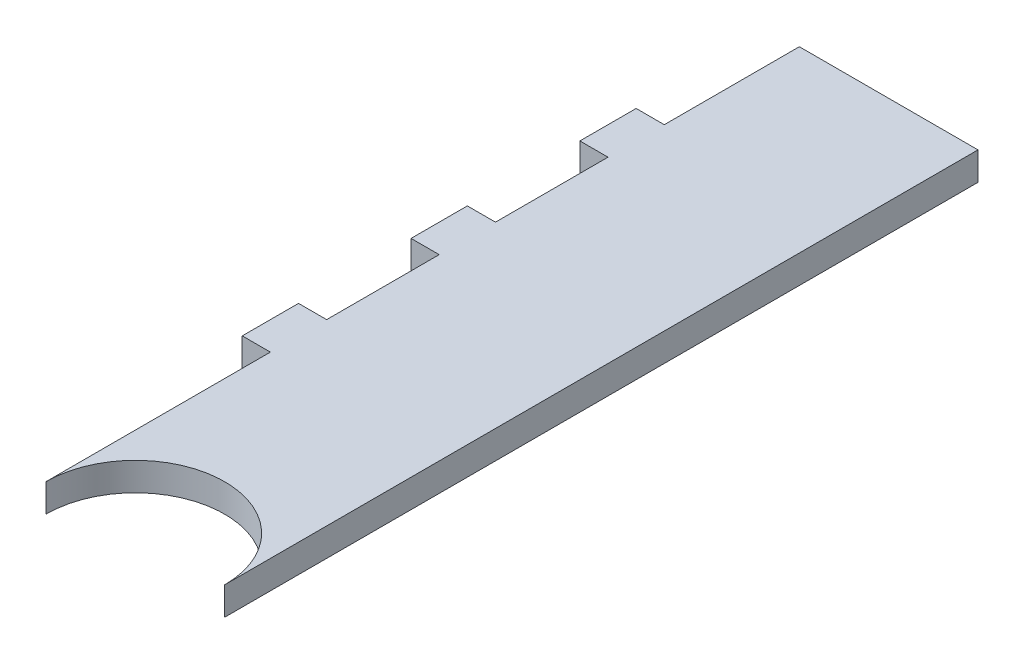
ISO-10303-21;
HEADER;
FILE_DESCRIPTION(('STEP AP214'),'2;1');
FILE_NAME('part.step','',(''),(''),'','','');
FILE_SCHEMA(('AUTOMOTIVE_DESIGN { 1 0 10303 214 1 1 1 1 }'));
ENDSEC;
DATA;
#1=APPLICATION_CONTEXT('core data for automotive mechanical design processes');
#2=APPLICATION_PROTOCOL_DEFINITION('international standard','automotive_design',2000,#1);
#3=PRODUCT_CONTEXT('',#1,'mechanical');
#4=PRODUCT('Part','Part','',(#3));
#5=PRODUCT_RELATED_PRODUCT_CATEGORY('part','',(#4));
#6=PRODUCT_DEFINITION_FORMATION('','',#4);
#7=PRODUCT_DEFINITION_CONTEXT('part definition',#1,'design');
#8=PRODUCT_DEFINITION('design','',#6,#7);
#9=PRODUCT_DEFINITION_SHAPE('','',#8);
#10=(LENGTH_UNIT() NAMED_UNIT(*) SI_UNIT(.MILLI.,.METRE.));
#11=(NAMED_UNIT(*) PLANE_ANGLE_UNIT() SI_UNIT($,.RADIAN.));
#12=(NAMED_UNIT(*) SI_UNIT($,.STERADIAN.) SOLID_ANGLE_UNIT());
#13=UNCERTAINTY_MEASURE_WITH_UNIT(LENGTH_MEASURE(1.E-05),#10,'distance_accuracy_value','');
#14=(GEOMETRIC_REPRESENTATION_CONTEXT(3) GLOBAL_UNCERTAINTY_ASSIGNED_CONTEXT((#13)) GLOBAL_UNIT_ASSIGNED_CONTEXT((#10,
#11,#12)) REPRESENTATION_CONTEXT('',''));
#15=CARTESIAN_POINT('',(0.,0.,0.));
#16=DIRECTION('',(0.,0.,1.));
#17=DIRECTION('',(1.,0.,0.));
#18=AXIS2_PLACEMENT_3D('',#15,#16,#17);
#19=CARTESIAN_POINT('',(-20.875,5.,-109.875));
#20=DIRECTION('',(0.,0.,1.));
#21=DIRECTION('',(1.,0.,0.));
#22=AXIS2_PLACEMENT_3D('',#19,#20,#21);
#23=PLANE('',#22);
#24=DIRECTION('',(-1.,0.,0.));
#25=VECTOR('',#24,1.);
#26=CARTESIAN_POINT('',(-20.875,0.,-109.875));
#27=LINE('',#26,#25);
#28=CARTESIAN_POINT('',(-15.875,0.,-109.875));
#29=VERTEX_POINT('',#28);
#30=CARTESIAN_POINT('',(-20.875,0.,-109.875));
#31=VERTEX_POINT('',#30);
#32=EDGE_CURVE('E183',#29,#31,#27,.T.);
#33=ORIENTED_EDGE('',*,*,#32,.T.);
#34=DIRECTION('',(0.,-1.,0.));
#35=VECTOR('',#34,1.);
#36=CARTESIAN_POINT('',(-20.875,5.,-109.875));
#37=LINE('',#36,#35);
#38=CARTESIAN_POINT('',(-20.875,5.,-109.875));
#39=VERTEX_POINT('',#38);
#40=EDGE_CURVE('E11',#39,#31,#37,.T.);
#41=ORIENTED_EDGE('',*,*,#40,.F.);
#42=DIRECTION('',(-1.,0.,0.));
#43=VECTOR('',#42,1.);
#44=CARTESIAN_POINT('',(-20.875,5.,-109.875));
#45=LINE('',#44,#43);
#46=CARTESIAN_POINT('',(-15.875,5.,-109.875));
#47=VERTEX_POINT('',#46);
#48=EDGE_CURVE('E213',#47,#39,#45,.T.);
#49=ORIENTED_EDGE('',*,*,#48,.F.);
#50=DIRECTION('',(0.,-1.,0.));
#51=VECTOR('',#50,1.);
#52=CARTESIAN_POINT('',(-15.875,5.,-109.875));
#53=LINE('',#52,#51);
#54=EDGE_CURVE('E179',#47,#29,#53,.T.);
#55=ORIENTED_EDGE('',*,*,#54,.T.);
#56=EDGE_LOOP('',(#33,#41,#49,#55));
#57=FACE_BOUND('',#56,.T.);
#58=ADVANCED_FACE('F39',(#57),#23,.F.);
#59=CARTESIAN_POINT('',(-20.875,5.,-99.875));
#60=DIRECTION('',(1.,0.,0.));
#61=DIRECTION('',(0.,0.,-1.));
#62=AXIS2_PLACEMENT_3D('',#59,#60,#61);
#63=PLANE('',#62);
#64=DIRECTION('',(0.,0.,1.));
#65=VECTOR('',#64,1.);
#66=CARTESIAN_POINT('',(-20.875,0.,-99.875));
#67=LINE('',#66,#65);
#68=CARTESIAN_POINT('',(-20.875,0.,-99.875));
#69=VERTEX_POINT('',#68);
#70=EDGE_CURVE('E186',#31,#69,#67,.T.);
#71=ORIENTED_EDGE('',*,*,#70,.T.);
#72=DIRECTION('',(0.,-1.,0.));
#73=VECTOR('',#72,1.);
#74=CARTESIAN_POINT('',(-20.875,5.,-99.875));
#75=LINE('',#74,#73);
#76=CARTESIAN_POINT('',(-20.875,5.,-99.875));
#77=VERTEX_POINT('',#76);
#78=EDGE_CURVE('E47',#77,#69,#75,.T.);
#79=ORIENTED_EDGE('',*,*,#78,.F.);
#80=DIRECTION('',(0.,0.,1.));
#81=VECTOR('',#80,1.);
#82=CARTESIAN_POINT('',(-20.875,5.,-99.875));
#83=LINE('',#82,#81);
#84=EDGE_CURVE('E122',#39,#77,#83,.T.);
#85=ORIENTED_EDGE('',*,*,#84,.F.);
#86=ORIENTED_EDGE('',*,*,#40,.T.);
#87=EDGE_LOOP('',(#71,#79,#85,#86));
#88=FACE_BOUND('',#87,.T.);
#89=ADVANCED_FACE('F311',(#88),#63,.F.);
#90=CARTESIAN_POINT('',(-15.875,5.,-99.875));
#91=DIRECTION('',(0.,0.,-1.));
#92=DIRECTION('',(-1.,0.,0.));
#93=AXIS2_PLACEMENT_3D('',#90,#91,#92);
#94=PLANE('',#93);
#95=DIRECTION('',(1.,0.,0.));
#96=VECTOR('',#95,1.);
#97=CARTESIAN_POINT('',(-15.875,0.,-99.875));
#98=LINE('',#97,#96);
#99=CARTESIAN_POINT('',(-15.875,0.,-99.875));
#100=VERTEX_POINT('',#99);
#101=EDGE_CURVE('E188',#69,#100,#98,.T.);
#102=ORIENTED_EDGE('',*,*,#101,.T.);
#103=DIRECTION('',(0.,-1.,0.));
#104=VECTOR('',#103,1.);
#105=CARTESIAN_POINT('',(-15.875,5.,-99.875));
#106=LINE('',#105,#104);
#107=CARTESIAN_POINT('',(-15.875,5.,-99.875));
#108=VERTEX_POINT('',#107);
#109=EDGE_CURVE('E244',#108,#100,#106,.T.);
#110=ORIENTED_EDGE('',*,*,#109,.F.);
#111=DIRECTION('',(1.,0.,0.));
#112=VECTOR('',#111,1.);
#113=CARTESIAN_POINT('',(-15.875,5.,-99.875));
#114=LINE('',#113,#112);
#115=EDGE_CURVE('E252',#77,#108,#114,.T.);
#116=ORIENTED_EDGE('',*,*,#115,.F.);
#117=ORIENTED_EDGE('',*,*,#78,.T.);
#118=EDGE_LOOP('',(#102,#110,#116,#117));
#119=FACE_BOUND('',#118,.T.);
#120=ADVANCED_FACE('F250',(#119),#94,.F.);
#121=CARTESIAN_POINT('',(-15.875,5.,-79.875));
#122=DIRECTION('',(1.,0.,0.));
#123=DIRECTION('',(0.,0.,-1.));
#124=AXIS2_PLACEMENT_3D('',#121,#122,#123);
#125=PLANE('',#124);
#126=DIRECTION('',(0.,0.,1.));
#127=VECTOR('',#126,1.);
#128=CARTESIAN_POINT('',(-15.875,0.,-79.875));
#129=LINE('',#128,#127);
#130=CARTESIAN_POINT('',(-15.875,0.,-79.875));
#131=VERTEX_POINT('',#130);
#132=EDGE_CURVE('E190',#100,#131,#129,.T.);
#133=ORIENTED_EDGE('',*,*,#132,.T.);
#134=DIRECTION('',(0.,-1.,0.));
#135=VECTOR('',#134,1.);
#136=CARTESIAN_POINT('',(-15.875,5.,-79.875));
#137=LINE('',#136,#135);
#138=CARTESIAN_POINT('',(-15.875,5.,-79.875));
#139=VERTEX_POINT('',#138);
#140=EDGE_CURVE('E241',#139,#131,#137,.T.);
#141=ORIENTED_EDGE('',*,*,#140,.F.);
#142=DIRECTION('',(0.,0.,1.));
#143=VECTOR('',#142,1.);
#144=CARTESIAN_POINT('',(-15.875,5.,-79.875));
#145=LINE('',#144,#143);
#146=EDGE_CURVE('E270',#108,#139,#145,.T.);
#147=ORIENTED_EDGE('',*,*,#146,.F.);
#148=ORIENTED_EDGE('',*,*,#109,.T.);
#149=EDGE_LOOP('',(#133,#141,#147,#148));
#150=FACE_BOUND('',#149,.T.);
#151=ADVANCED_FACE('F261',(#150),#125,.F.);
#152=CARTESIAN_POINT('',(-20.875,5.,-79.875));
#153=DIRECTION('',(0.,0.,1.));
#154=DIRECTION('',(1.,0.,0.));
#155=AXIS2_PLACEMENT_3D('',#152,#153,#154);
#156=PLANE('',#155);
#157=DIRECTION('',(-1.,0.,0.));
#158=VECTOR('',#157,1.);
#159=CARTESIAN_POINT('',(-20.875,0.,-79.875));
#160=LINE('',#159,#158);
#161=CARTESIAN_POINT('',(-20.875,0.,-79.875));
#162=VERTEX_POINT('',#161);
#163=EDGE_CURVE('E192',#131,#162,#160,.T.);
#164=ORIENTED_EDGE('',*,*,#163,.T.);
#165=DIRECTION('',(0.,-1.,0.));
#166=VECTOR('',#165,1.);
#167=CARTESIAN_POINT('',(-20.875,5.,-79.875));
#168=LINE('',#167,#166);
#169=CARTESIAN_POINT('',(-20.875,5.,-79.875));
#170=VERTEX_POINT('',#169);
#171=EDGE_CURVE('E238',#170,#162,#168,.T.);
#172=ORIENTED_EDGE('',*,*,#171,.F.);
#173=DIRECTION('',(-1.,0.,0.));
#174=VECTOR('',#173,1.);
#175=CARTESIAN_POINT('',(-20.875,5.,-79.875));
#176=LINE('',#175,#174);
#177=EDGE_CURVE('E267',#139,#170,#176,.T.);
#178=ORIENTED_EDGE('',*,*,#177,.F.);
#179=ORIENTED_EDGE('',*,*,#140,.T.);
#180=EDGE_LOOP('',(#164,#172,#178,#179));
#181=FACE_BOUND('',#180,.T.);
#182=ADVANCED_FACE('F265',(#181),#156,.F.);
#183=CARTESIAN_POINT('',(-20.875,5.,-69.875));
#184=DIRECTION('',(1.,0.,0.));
#185=DIRECTION('',(0.,0.,-1.));
#186=AXIS2_PLACEMENT_3D('',#183,#184,#185);
#187=PLANE('',#186);
#188=DIRECTION('',(0.,0.,1.));
#189=VECTOR('',#188,1.);
#190=CARTESIAN_POINT('',(-20.875,0.,-69.875));
#191=LINE('',#190,#189);
#192=CARTESIAN_POINT('',(-20.875,0.,-69.875));
#193=VERTEX_POINT('',#192);
#194=EDGE_CURVE('E194',#162,#193,#191,.T.);
#195=ORIENTED_EDGE('',*,*,#194,.T.);
#196=DIRECTION('',(0.,-1.,0.));
#197=VECTOR('',#196,1.);
#198=CARTESIAN_POINT('',(-20.875,5.,-69.875));
#199=LINE('',#198,#197);
#200=CARTESIAN_POINT('',(-20.875,5.,-69.875));
#201=VERTEX_POINT('',#200);
#202=EDGE_CURVE('E235',#201,#193,#199,.T.);
#203=ORIENTED_EDGE('',*,*,#202,.F.);
#204=DIRECTION('',(0.,0.,1.));
#205=VECTOR('',#204,1.);
#206=CARTESIAN_POINT('',(-20.875,5.,-69.875));
#207=LINE('',#206,#205);
#208=EDGE_CURVE('E269',#170,#201,#207,.T.);
#209=ORIENTED_EDGE('',*,*,#208,.F.);
#210=ORIENTED_EDGE('',*,*,#171,.T.);
#211=EDGE_LOOP('',(#195,#203,#209,#210));
#212=FACE_BOUND('',#211,.T.);
#213=ADVANCED_FACE('F324',(#212),#187,.F.);
#214=CARTESIAN_POINT('',(-15.875,5.,-69.875));
#215=DIRECTION('',(0.,0.,-1.));
#216=DIRECTION('',(-1.,0.,0.));
#217=AXIS2_PLACEMENT_3D('',#214,#215,#216);
#218=PLANE('',#217);
#219=DIRECTION('',(1.,0.,0.));
#220=VECTOR('',#219,1.);
#221=CARTESIAN_POINT('',(-15.875,0.,-69.875));
#222=LINE('',#221,#220);
#223=CARTESIAN_POINT('',(-15.875,0.,-69.875));
#224=VERTEX_POINT('',#223);
#225=EDGE_CURVE('E196',#193,#224,#222,.T.);
#226=ORIENTED_EDGE('',*,*,#225,.T.);
#227=DIRECTION('',(0.,-1.,0.));
#228=VECTOR('',#227,1.);
#229=CARTESIAN_POINT('',(-15.875,5.,-69.875));
#230=LINE('',#229,#228);
#231=CARTESIAN_POINT('',(-15.875,5.,-69.875));
#232=VERTEX_POINT('',#231);
#233=EDGE_CURVE('E232',#232,#224,#230,.T.);
#234=ORIENTED_EDGE('',*,*,#233,.F.);
#235=DIRECTION('',(1.,0.,0.));
#236=VECTOR('',#235,1.);
#237=CARTESIAN_POINT('',(-15.875,5.,-69.875));
#238=LINE('',#237,#236);
#239=EDGE_CURVE('E272',#201,#232,#238,.T.);
#240=ORIENTED_EDGE('',*,*,#239,.F.);
#241=ORIENTED_EDGE('',*,*,#202,.T.);
#242=EDGE_LOOP('',(#226,#234,#240,#241));
#243=FACE_BOUND('',#242,.T.);
#244=ADVANCED_FACE('F327',(#243),#218,.F.);
#245=CARTESIAN_POINT('',(-15.875,5.,-49.875));
#246=DIRECTION('',(1.,0.,0.));
#247=DIRECTION('',(0.,0.,-1.));
#248=AXIS2_PLACEMENT_3D('',#245,#246,#247);
#249=PLANE('',#248);
#250=DIRECTION('',(0.,0.,1.));
#251=VECTOR('',#250,1.);
#252=CARTESIAN_POINT('',(-15.875,0.,-49.875));
#253=LINE('',#252,#251);
#254=CARTESIAN_POINT('',(-15.875,0.,-49.875));
#255=VERTEX_POINT('',#254);
#256=EDGE_CURVE('E198',#224,#255,#253,.T.);
#257=ORIENTED_EDGE('',*,*,#256,.T.);
#258=DIRECTION('',(0.,-1.,0.));
#259=VECTOR('',#258,1.);
#260=CARTESIAN_POINT('',(-15.875,5.,-49.875));
#261=LINE('',#260,#259);
#262=CARTESIAN_POINT('',(-15.875,5.,-49.875));
#263=VERTEX_POINT('',#262);
#264=EDGE_CURVE('E229',#263,#255,#261,.T.);
#265=ORIENTED_EDGE('',*,*,#264,.F.);
#266=DIRECTION('',(0.,0.,1.));
#267=VECTOR('',#266,1.);
#268=CARTESIAN_POINT('',(-15.875,5.,-49.875));
#269=LINE('',#268,#267);
#270=EDGE_CURVE('E278',#232,#263,#269,.T.);
#271=ORIENTED_EDGE('',*,*,#270,.F.);
#272=ORIENTED_EDGE('',*,*,#233,.T.);
#273=EDGE_LOOP('',(#257,#265,#271,#272));
#274=FACE_BOUND('',#273,.T.);
#275=ADVANCED_FACE('F331',(#274),#249,.F.);
#276=CARTESIAN_POINT('',(-20.875,5.,-49.875));
#277=DIRECTION('',(0.,0.,1.));
#278=DIRECTION('',(1.,0.,0.));
#279=AXIS2_PLACEMENT_3D('',#276,#277,#278);
#280=PLANE('',#279);
#281=DIRECTION('',(-1.,0.,0.));
#282=VECTOR('',#281,1.);
#283=CARTESIAN_POINT('',(-20.875,0.,-49.875));
#284=LINE('',#283,#282);
#285=CARTESIAN_POINT('',(-20.875,0.,-49.875));
#286=VERTEX_POINT('',#285);
#287=EDGE_CURVE('E200',#255,#286,#284,.T.);
#288=ORIENTED_EDGE('',*,*,#287,.T.);
#289=DIRECTION('',(0.,-1.,0.));
#290=VECTOR('',#289,1.);
#291=CARTESIAN_POINT('',(-20.875,5.,-49.875));
#292=LINE('',#291,#290);
#293=CARTESIAN_POINT('',(-20.875,5.,-49.875));
#294=VERTEX_POINT('',#293);
#295=EDGE_CURVE('E226',#294,#286,#292,.T.);
#296=ORIENTED_EDGE('',*,*,#295,.F.);
#297=DIRECTION('',(-1.,0.,0.));
#298=VECTOR('',#297,1.);
#299=CARTESIAN_POINT('',(-20.875,5.,-49.875));
#300=LINE('',#299,#298);
#301=EDGE_CURVE('E280',#263,#294,#300,.T.);
#302=ORIENTED_EDGE('',*,*,#301,.F.);
#303=ORIENTED_EDGE('',*,*,#264,.T.);
#304=EDGE_LOOP('',(#288,#296,#302,#303));
#305=FACE_BOUND('',#304,.T.);
#306=ADVANCED_FACE('F335',(#305),#280,.F.);
#307=CARTESIAN_POINT('',(-20.875,5.,-39.875));
#308=DIRECTION('',(1.,0.,0.));
#309=DIRECTION('',(0.,0.,-1.));
#310=AXIS2_PLACEMENT_3D('',#307,#308,#309);
#311=PLANE('',#310);
#312=DIRECTION('',(0.,0.,1.));
#313=VECTOR('',#312,1.);
#314=CARTESIAN_POINT('',(-20.875,0.,-39.875));
#315=LINE('',#314,#313);
#316=CARTESIAN_POINT('',(-20.875,0.,-39.875));
#317=VERTEX_POINT('',#316);
#318=EDGE_CURVE('E202',#286,#317,#315,.T.);
#319=ORIENTED_EDGE('',*,*,#318,.T.);
#320=DIRECTION('',(0.,-1.,0.));
#321=VECTOR('',#320,1.);
#322=CARTESIAN_POINT('',(-20.875,5.,-39.875));
#323=LINE('',#322,#321);
#324=CARTESIAN_POINT('',(-20.875,5.,-39.875));
#325=VERTEX_POINT('',#324);
#326=EDGE_CURVE('E223',#325,#317,#323,.T.);
#327=ORIENTED_EDGE('',*,*,#326,.F.);
#328=DIRECTION('',(0.,0.,1.));
#329=VECTOR('',#328,1.);
#330=CARTESIAN_POINT('',(-20.875,5.,-39.875));
#331=LINE('',#330,#329);
#332=EDGE_CURVE('E282',#294,#325,#331,.T.);
#333=ORIENTED_EDGE('',*,*,#332,.F.);
#334=ORIENTED_EDGE('',*,*,#295,.T.);
#335=EDGE_LOOP('',(#319,#327,#333,#334));
#336=FACE_BOUND('',#335,.T.);
#337=ADVANCED_FACE('F339',(#336),#311,.F.);
#338=CARTESIAN_POINT('',(-15.875,5.,-39.875));
#339=DIRECTION('',(0.,0.,-1.));
#340=DIRECTION('',(-1.,0.,0.));
#341=AXIS2_PLACEMENT_3D('',#338,#339,#340);
#342=PLANE('',#341);
#343=DIRECTION('',(1.,0.,0.));
#344=VECTOR('',#343,1.);
#345=CARTESIAN_POINT('',(-15.875,0.,-39.875));
#346=LINE('',#345,#344);
#347=CARTESIAN_POINT('',(-15.875,0.,-39.875));
#348=VERTEX_POINT('',#347);
#349=EDGE_CURVE('E204',#317,#348,#346,.T.);
#350=ORIENTED_EDGE('',*,*,#349,.T.);
#351=DIRECTION('',(0.,-1.,0.));
#352=VECTOR('',#351,1.);
#353=CARTESIAN_POINT('',(-15.875,5.,-39.875));
#354=LINE('',#353,#352);
#355=CARTESIAN_POINT('',(-15.875,5.,-39.875));
#356=VERTEX_POINT('',#355);
#357=EDGE_CURVE('E220',#356,#348,#354,.T.);
#358=ORIENTED_EDGE('',*,*,#357,.F.);
#359=DIRECTION('',(1.,0.,0.));
#360=VECTOR('',#359,1.);
#361=CARTESIAN_POINT('',(-15.875,5.,-39.875));
#362=LINE('',#361,#360);
#363=EDGE_CURVE('E284',#325,#356,#362,.T.);
#364=ORIENTED_EDGE('',*,*,#363,.F.);
#365=ORIENTED_EDGE('',*,*,#326,.T.);
#366=EDGE_LOOP('',(#350,#358,#364,#365));
#367=FACE_BOUND('',#366,.T.);
#368=ADVANCED_FACE('F343',(#367),#342,.F.);
#369=CARTESIAN_POINT('',(-15.875,5.,0.));
#370=DIRECTION('',(1.,0.,0.));
#371=DIRECTION('',(0.,0.,-1.));
#372=AXIS2_PLACEMENT_3D('',#369,#370,#371);
#373=PLANE('',#372);
#374=DIRECTION('',(0.,0.,1.));
#375=VECTOR('',#374,1.);
#376=CARTESIAN_POINT('',(-15.875,0.,0.));
#377=LINE('',#376,#375);
#378=CARTESIAN_POINT('',(-15.875,0.,0.));
#379=VERTEX_POINT('',#378);
#380=EDGE_CURVE('E206',#348,#379,#377,.T.);
#381=ORIENTED_EDGE('',*,*,#380,.T.);
#382=DIRECTION('',(0.,-1.,0.));
#383=VECTOR('',#382,1.);
#384=CARTESIAN_POINT('',(-15.875,5.,0.));
#385=LINE('',#384,#383);
#386=CARTESIAN_POINT('',(-15.875,5.,0.));
#387=VERTEX_POINT('',#386);
#388=EDGE_CURVE('E217',#387,#379,#385,.T.);
#389=ORIENTED_EDGE('',*,*,#388,.F.);
#390=DIRECTION('',(0.,0.,1.));
#391=VECTOR('',#390,1.);
#392=CARTESIAN_POINT('',(-15.875,5.,0.));
#393=LINE('',#392,#391);
#394=EDGE_CURVE('E286',#356,#387,#393,.T.);
#395=ORIENTED_EDGE('',*,*,#394,.F.);
#396=ORIENTED_EDGE('',*,*,#357,.T.);
#397=EDGE_LOOP('',(#381,#389,#395,#396));
#398=FACE_BOUND('',#397,.T.);
#399=ADVANCED_FACE('F292',(#398),#373,.F.);
#400=CARTESIAN_POINT('',(0.,5.,0.));
#401=DIRECTION('',(0.,-1.,0.));
#402=DIRECTION('',(0.,0.,-1.));
#403=AXIS2_PLACEMENT_3D('',#400,#401,#402);
#404=CYLINDRICAL_SURFACE('',#403,15.875);
#405=CARTESIAN_POINT('',(0.,0.,0.));
#406=DIRECTION('',(0.,-1.,0.));
#407=DIRECTION('',(0.,0.,1.));
#408=AXIS2_PLACEMENT_3D('',#405,#406,#407);
#409=CIRCLE('',#408,15.875);
#410=CARTESIAN_POINT('',(15.875,0.,0.));
#411=VERTEX_POINT('',#410);
#412=EDGE_CURVE('E208',#379,#411,#409,.T.);
#413=ORIENTED_EDGE('',*,*,#412,.T.);
#414=DIRECTION('',(0.,-1.,0.));
#415=VECTOR('',#414,1.);
#416=CARTESIAN_POINT('',(15.875,5.,0.));
#417=LINE('',#416,#415);
#418=CARTESIAN_POINT('',(15.875,5.,0.));
#419=VERTEX_POINT('',#418);
#420=EDGE_CURVE('E174',#419,#411,#417,.T.);
#421=ORIENTED_EDGE('',*,*,#420,.F.);
#422=CARTESIAN_POINT('',(0.,5.,0.));
#423=DIRECTION('',(0.,-1.,0.));
#424=DIRECTION('',(0.,0.,1.));
#425=AXIS2_PLACEMENT_3D('',#422,#423,#424);
#426=CIRCLE('',#425,15.875);
#427=EDGE_CURVE('E165',#387,#419,#426,.T.);
#428=ORIENTED_EDGE('',*,*,#427,.F.);
#429=ORIENTED_EDGE('',*,*,#388,.T.);
#430=EDGE_LOOP('',(#413,#421,#428,#429));
#431=FACE_BOUND('',#430,.T.);
#432=ADVANCED_FACE('F296',(#431),#404,.F.);
#433=CARTESIAN_POINT('',(15.875,5.,-133.875));
#434=DIRECTION('',(-1.,0.,0.));
#435=DIRECTION('',(0.,0.,1.));
#436=AXIS2_PLACEMENT_3D('',#433,#434,#435);
#437=PLANE('',#436);
#438=DIRECTION('',(0.,0.,-1.));
#439=VECTOR('',#438,1.);
#440=CARTESIAN_POINT('',(15.875,0.,-133.875));
#441=LINE('',#440,#439);
#442=CARTESIAN_POINT('',(15.875,0.,-133.875));
#443=VERTEX_POINT('',#442);
#444=EDGE_CURVE('E173',#411,#443,#441,.T.);
#445=ORIENTED_EDGE('',*,*,#444,.T.);
#446=DIRECTION('',(0.,-1.,0.));
#447=VECTOR('',#446,1.);
#448=CARTESIAN_POINT('',(15.875,5.,-133.875));
#449=LINE('',#448,#447);
#450=CARTESIAN_POINT('',(15.875,5.,-133.875));
#451=VERTEX_POINT('',#450);
#452=EDGE_CURVE('E170',#451,#443,#449,.T.);
#453=ORIENTED_EDGE('',*,*,#452,.F.);
#454=DIRECTION('',(0.,0.,-1.));
#455=VECTOR('',#454,1.);
#456=CARTESIAN_POINT('',(15.875,5.,-133.875));
#457=LINE('',#456,#455);
#458=EDGE_CURVE('E159',#419,#451,#457,.T.);
#459=ORIENTED_EDGE('',*,*,#458,.F.);
#460=ORIENTED_EDGE('',*,*,#420,.T.);
#461=EDGE_LOOP('',(#445,#453,#459,#460));
#462=FACE_BOUND('',#461,.T.);
#463=ADVANCED_FACE('F171',(#462),#437,.F.);
#464=CARTESIAN_POINT('',(-15.875,5.,-133.875));
#465=DIRECTION('',(0.,0.,1.));
#466=DIRECTION('',(1.,0.,0.));
#467=AXIS2_PLACEMENT_3D('',#464,#465,#466);
#468=PLANE('',#467);
#469=DIRECTION('',(-1.,0.,0.));
#470=VECTOR('',#469,1.);
#471=CARTESIAN_POINT('',(-15.875,0.,-133.875));
#472=LINE('',#471,#470);
#473=CARTESIAN_POINT('',(-15.875,0.,-133.875));
#474=VERTEX_POINT('',#473);
#475=EDGE_CURVE('E108',#443,#474,#472,.T.);
#476=ORIENTED_EDGE('',*,*,#475,.T.);
#477=DIRECTION('',(0.,-1.,0.));
#478=VECTOR('',#477,1.);
#479=CARTESIAN_POINT('',(-15.875,5.,-133.875));
#480=LINE('',#479,#478);
#481=CARTESIAN_POINT('',(-15.875,5.,-133.875));
#482=VERTEX_POINT('',#481);
#483=EDGE_CURVE('E175',#482,#474,#480,.T.);
#484=ORIENTED_EDGE('',*,*,#483,.F.);
#485=DIRECTION('',(-1.,0.,0.));
#486=VECTOR('',#485,1.);
#487=CARTESIAN_POINT('',(-15.875,5.,-133.875));
#488=LINE('',#487,#486);
#489=EDGE_CURVE('E163',#451,#482,#488,.T.);
#490=ORIENTED_EDGE('',*,*,#489,.F.);
#491=ORIENTED_EDGE('',*,*,#452,.T.);
#492=EDGE_LOOP('',(#476,#484,#490,#491));
#493=FACE_BOUND('',#492,.T.);
#494=ADVANCED_FACE('F177',(#493),#468,.F.);
#495=CARTESIAN_POINT('',(-15.875,5.,-109.875));
#496=DIRECTION('',(1.,0.,0.));
#497=DIRECTION('',(0.,0.,-1.));
#498=AXIS2_PLACEMENT_3D('',#495,#496,#497);
#499=PLANE('',#498);
#500=DIRECTION('',(0.,0.,1.));
#501=VECTOR('',#500,1.);
#502=CARTESIAN_POINT('',(-15.875,0.,-109.875));
#503=LINE('',#502,#501);
#504=EDGE_CURVE('E114',#474,#29,#503,.T.);
#505=ORIENTED_EDGE('',*,*,#504,.T.);
#506=ORIENTED_EDGE('',*,*,#54,.F.);
#507=DIRECTION('',(0.,0.,1.));
#508=VECTOR('',#507,1.);
#509=CARTESIAN_POINT('',(-15.875,5.,-109.875));
#510=LINE('',#509,#508);
#511=EDGE_CURVE('E55',#482,#47,#510,.T.);
#512=ORIENTED_EDGE('',*,*,#511,.F.);
#513=ORIENTED_EDGE('',*,*,#483,.T.);
#514=EDGE_LOOP('',(#505,#506,#512,#513));
#515=FACE_BOUND('',#514,.T.);
#516=ADVANCED_FACE('F300',(#515),#499,.F.);
#517=CARTESIAN_POINT('',(0.,5.,0.));
#518=DIRECTION('',(0.,1.,0.));
#519=DIRECTION('',(0.,0.,1.));
#520=AXIS2_PLACEMENT_3D('',#517,#518,#519);
#521=PLANE('',#520);
#522=ORIENTED_EDGE('',*,*,#48,.T.);
#523=ORIENTED_EDGE('',*,*,#84,.T.);
#524=ORIENTED_EDGE('',*,*,#115,.T.);
#525=ORIENTED_EDGE('',*,*,#146,.T.);
#526=ORIENTED_EDGE('',*,*,#177,.T.);
#527=ORIENTED_EDGE('',*,*,#208,.T.);
#528=ORIENTED_EDGE('',*,*,#239,.T.);
#529=ORIENTED_EDGE('',*,*,#270,.T.);
#530=ORIENTED_EDGE('',*,*,#301,.T.);
#531=ORIENTED_EDGE('',*,*,#332,.T.);
#532=ORIENTED_EDGE('',*,*,#363,.T.);
#533=ORIENTED_EDGE('',*,*,#394,.T.);
#534=ORIENTED_EDGE('',*,*,#427,.T.);
#535=ORIENTED_EDGE('',*,*,#458,.T.);
#536=ORIENTED_EDGE('',*,*,#489,.T.);
#537=ORIENTED_EDGE('',*,*,#511,.T.);
#538=EDGE_LOOP('',(#522,#523,#524,#525,#526,#527,#528,#529,#530,#531,#532,#533,#534,#535,#536,#537));
#539=FACE_BOUND('',#538,.T.);
#540=ADVANCED_FACE('F161',(#539),#521,.T.);
#541=CARTESIAN_POINT('',(0.,0.,0.));
#542=DIRECTION('',(0.,1.,0.));
#543=DIRECTION('',(0.,0.,1.));
#544=AXIS2_PLACEMENT_3D('',#541,#542,#543);
#545=PLANE('',#544);
#546=ORIENTED_EDGE('',*,*,#32,.F.);
#547=ORIENTED_EDGE('',*,*,#504,.F.);
#548=ORIENTED_EDGE('',*,*,#475,.F.);
#549=ORIENTED_EDGE('',*,*,#444,.F.);
#550=ORIENTED_EDGE('',*,*,#412,.F.);
#551=ORIENTED_EDGE('',*,*,#380,.F.);
#552=ORIENTED_EDGE('',*,*,#349,.F.);
#553=ORIENTED_EDGE('',*,*,#318,.F.);
#554=ORIENTED_EDGE('',*,*,#287,.F.);
#555=ORIENTED_EDGE('',*,*,#256,.F.);
#556=ORIENTED_EDGE('',*,*,#225,.F.);
#557=ORIENTED_EDGE('',*,*,#194,.F.);
#558=ORIENTED_EDGE('',*,*,#163,.F.);
#559=ORIENTED_EDGE('',*,*,#132,.F.);
#560=ORIENTED_EDGE('',*,*,#101,.F.);
#561=ORIENTED_EDGE('',*,*,#70,.F.);
#562=EDGE_LOOP('',(#546,#547,#548,#549,#550,#551,#552,#553,#554,#555,#556,#557,#558,#559,#560,#561));
#563=FACE_BOUND('',#562,.T.);
#564=ADVANCED_FACE('F256',(#563),#545,.F.);
#565=CLOSED_SHELL('',(#58,#89,#120,#151,#182,#213,#244,#275,#306,#337,#368,#399,#432,#463,#494,
#516,#540,#564));
#566=MANIFOLD_SOLID_BREP('B2',#565);
#567=ADVANCED_BREP_SHAPE_REPRESENTATION('',(#18,#566),#14);
#568=SHAPE_DEFINITION_REPRESENTATION(#9,#567);
ENDSEC;
END-ISO-10303-21;
